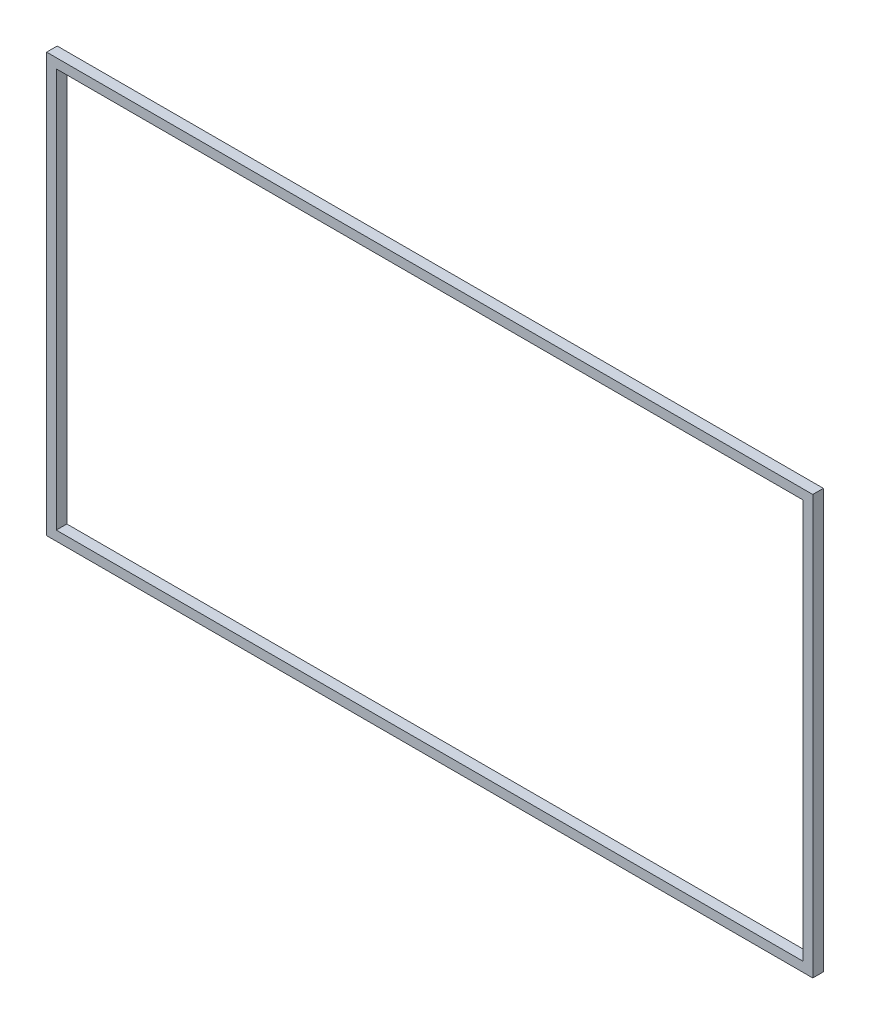
ISO-10303-21;
HEADER;
FILE_DESCRIPTION(('STEP AP214'),'2;1');
FILE_NAME('part.step','',(''),(''),'','','');
FILE_SCHEMA(('AUTOMOTIVE_DESIGN { 1 0 10303 214 1 1 1 1 }'));
ENDSEC;
DATA;
#1=APPLICATION_CONTEXT('core data for automotive mechanical design processes');
#2=APPLICATION_PROTOCOL_DEFINITION('international standard','automotive_design',2000,#1);
#3=PRODUCT_CONTEXT('',#1,'mechanical');
#4=PRODUCT('Part','Part','',(#3));
#5=PRODUCT_RELATED_PRODUCT_CATEGORY('part','',(#4));
#6=PRODUCT_DEFINITION_FORMATION('','',#4);
#7=PRODUCT_DEFINITION_CONTEXT('part definition',#1,'design');
#8=PRODUCT_DEFINITION('design','',#6,#7);
#9=PRODUCT_DEFINITION_SHAPE('','',#8);
#10=(LENGTH_UNIT() NAMED_UNIT(*) SI_UNIT(.MILLI.,.METRE.));
#11=(NAMED_UNIT(*) PLANE_ANGLE_UNIT() SI_UNIT($,.RADIAN.));
#12=(NAMED_UNIT(*) SI_UNIT($,.STERADIAN.) SOLID_ANGLE_UNIT());
#13=UNCERTAINTY_MEASURE_WITH_UNIT(LENGTH_MEASURE(1.E-05),#10,'distance_accuracy_value','');
#14=(GEOMETRIC_REPRESENTATION_CONTEXT(3) GLOBAL_UNCERTAINTY_ASSIGNED_CONTEXT((#13)) GLOBAL_UNIT_ASSIGNED_CONTEXT((#10,
#11,#12)) REPRESENTATION_CONTEXT('',''));
#15=CARTESIAN_POINT('',(0.,0.,0.));
#16=DIRECTION('',(0.,0.,1.));
#17=DIRECTION('',(1.,0.,0.));
#18=AXIS2_PLACEMENT_3D('',#15,#16,#17);
#19=CARTESIAN_POINT('',(-5.684341886081E-13,-1.293757720337E-13,33.));
#20=DIRECTION('',(0.,0.,1.));
#21=DIRECTION('',(1.,0.,0.));
#22=AXIS2_PLACEMENT_3D('',#19,#20,#21);
#23=PLANE('',#22);
#24=DIRECTION('',(0.,-1.,0.));
#25=VECTOR('',#24,1.);
#26=CARTESIAN_POINT('',(-1162.,621.5,33.));
#27=LINE('',#26,#25);
#28=CARTESIAN_POINT('',(-1162.,621.5,33.));
#29=VERTEX_POINT('',#28);
#30=CARTESIAN_POINT('',(-1162.,-621.5,33.));
#31=VERTEX_POINT('',#30);
#32=EDGE_CURVE('E157',#29,#31,#27,.T.);
#33=ORIENTED_EDGE('',*,*,#32,.F.);
#34=DIRECTION('',(-1.,0.,0.));
#35=VECTOR('',#34,1.);
#36=CARTESIAN_POINT('',(1162.,621.5,33.));
#37=LINE('',#36,#35);
#38=CARTESIAN_POINT('',(1162.,621.5,33.));
#39=VERTEX_POINT('',#38);
#40=EDGE_CURVE('E186',#39,#29,#37,.T.);
#41=ORIENTED_EDGE('',*,*,#40,.F.);
#42=DIRECTION('',(0.,1.,0.));
#43=VECTOR('',#42,1.);
#44=CARTESIAN_POINT('',(1162.,-621.5,33.));
#45=LINE('',#44,#43);
#46=CARTESIAN_POINT('',(1162.,-621.5,33.));
#47=VERTEX_POINT('',#46);
#48=EDGE_CURVE('E196',#47,#39,#45,.T.);
#49=ORIENTED_EDGE('',*,*,#48,.F.);
#50=DIRECTION('',(1.,0.,0.));
#51=VECTOR('',#50,1.);
#52=CARTESIAN_POINT('',(-1162.,-621.5,33.));
#53=LINE('',#52,#51);
#54=EDGE_CURVE('E27',#31,#47,#53,.T.);
#55=ORIENTED_EDGE('',*,*,#54,.F.);
#56=EDGE_LOOP('',(#33,#41,#49,#55));
#57=FACE_BOUND('',#56,.T.);
#58=DIRECTION('',(1.,0.,0.));
#59=VECTOR('',#58,1.);
#60=CARTESIAN_POINT('',(-1192.,-651.5,33.));
#61=LINE('',#60,#59);
#62=CARTESIAN_POINT('',(-1192.,-651.5,33.));
#63=VERTEX_POINT('',#62);
#64=CARTESIAN_POINT('',(1192.,-651.5,33.));
#65=VERTEX_POINT('',#64);
#66=EDGE_CURVE('E137',#63,#65,#61,.T.);
#67=ORIENTED_EDGE('',*,*,#66,.T.);
#68=DIRECTION('',(0.,1.,0.));
#69=VECTOR('',#68,1.);
#70=CARTESIAN_POINT('',(1192.,-651.5,33.));
#71=LINE('',#70,#69);
#72=CARTESIAN_POINT('',(1192.,651.5,33.));
#73=VERTEX_POINT('',#72);
#74=EDGE_CURVE('E111',#65,#73,#71,.T.);
#75=ORIENTED_EDGE('',*,*,#74,.T.);
#76=DIRECTION('',(-1.,0.,0.));
#77=VECTOR('',#76,1.);
#78=CARTESIAN_POINT('',(1192.,651.5,33.));
#79=LINE('',#78,#77);
#80=CARTESIAN_POINT('',(-1192.,651.5,33.));
#81=VERTEX_POINT('',#80);
#82=EDGE_CURVE('E130',#73,#81,#79,.T.);
#83=ORIENTED_EDGE('',*,*,#82,.T.);
#84=DIRECTION('',(0.,-1.,0.));
#85=VECTOR('',#84,1.);
#86=CARTESIAN_POINT('',(-1192.,651.5,33.));
#87=LINE('',#86,#85);
#88=EDGE_CURVE('E101',#81,#63,#87,.T.);
#89=ORIENTED_EDGE('',*,*,#88,.T.);
#90=EDGE_LOOP('',(#67,#75,#83,#89));
#91=FACE_BOUND('',#90,.T.);
#92=ADVANCED_FACE('F17',(#57,#91),#23,.T.);
#93=CARTESIAN_POINT('',(-5.684341886081E-13,-1.284275273855E-13,4.547473508865E-13));
#94=DIRECTION('',(0.,0.,1.));
#95=DIRECTION('',(1.,0.,0.));
#96=AXIS2_PLACEMENT_3D('',#93,#94,#95);
#97=PLANE('',#96);
#98=DIRECTION('',(1.,0.,0.));
#99=VECTOR('',#98,1.);
#100=CARTESIAN_POINT('',(-1162.,-621.5,-4.547473508865E-13));
#101=LINE('',#100,#99);
#102=CARTESIAN_POINT('',(-1162.,-621.5,-4.547473508865E-13));
#103=VERTEX_POINT('',#102);
#104=CARTESIAN_POINT('',(1162.,-621.5,0.));
#105=VERTEX_POINT('',#104);
#106=EDGE_CURVE('E11',#103,#105,#101,.T.);
#107=ORIENTED_EDGE('',*,*,#106,.T.);
#108=DIRECTION('',(0.,1.,0.));
#109=VECTOR('',#108,1.);
#110=CARTESIAN_POINT('',(1162.,-621.5,0.));
#111=LINE('',#110,#109);
#112=CARTESIAN_POINT('',(1162.,621.5,0.));
#113=VERTEX_POINT('',#112);
#114=EDGE_CURVE('E80',#105,#113,#111,.T.);
#115=ORIENTED_EDGE('',*,*,#114,.T.);
#116=DIRECTION('',(-1.,0.,0.));
#117=VECTOR('',#116,1.);
#118=CARTESIAN_POINT('',(1162.,621.5,0.));
#119=LINE('',#118,#117);
#120=CARTESIAN_POINT('',(-1162.,621.5,-4.547473508865E-13));
#121=VERTEX_POINT('',#120);
#122=EDGE_CURVE('E189',#113,#121,#119,.T.);
#123=ORIENTED_EDGE('',*,*,#122,.T.);
#124=DIRECTION('',(0.,-1.,0.));
#125=VECTOR('',#124,1.);
#126=CARTESIAN_POINT('',(-1162.,621.5,-4.547473508865E-13));
#127=LINE('',#126,#125);
#128=EDGE_CURVE('E179',#121,#103,#127,.T.);
#129=ORIENTED_EDGE('',*,*,#128,.T.);
#130=EDGE_LOOP('',(#107,#115,#123,#129));
#131=FACE_BOUND('',#130,.T.);
#132=DIRECTION('',(0.,-1.,0.));
#133=VECTOR('',#132,1.);
#134=CARTESIAN_POINT('',(-1192.,651.5,4.547473508865E-13));
#135=LINE('',#134,#133);
#136=CARTESIAN_POINT('',(-1192.,651.5,4.547473508865E-13));
#137=VERTEX_POINT('',#136);
#138=CARTESIAN_POINT('',(-1192.,-651.5,4.547473508865E-13));
#139=VERTEX_POINT('',#138);
#140=EDGE_CURVE('E121',#137,#139,#135,.T.);
#141=ORIENTED_EDGE('',*,*,#140,.F.);
#142=DIRECTION('',(-1.,0.,0.));
#143=VECTOR('',#142,1.);
#144=CARTESIAN_POINT('',(1192.,651.5,0.));
#145=LINE('',#144,#143);
#146=CARTESIAN_POINT('',(1192.,651.5,0.));
#147=VERTEX_POINT('',#146);
#148=EDGE_CURVE('E91',#147,#137,#145,.T.);
#149=ORIENTED_EDGE('',*,*,#148,.F.);
#150=DIRECTION('',(0.,1.,0.));
#151=VECTOR('',#150,1.);
#152=CARTESIAN_POINT('',(1192.,-651.5,0.));
#153=LINE('',#152,#151);
#154=CARTESIAN_POINT('',(1192.,-651.5,0.));
#155=VERTEX_POINT('',#154);
#156=EDGE_CURVE('E139',#155,#147,#153,.T.);
#157=ORIENTED_EDGE('',*,*,#156,.F.);
#158=DIRECTION('',(1.,0.,0.));
#159=VECTOR('',#158,1.);
#160=CARTESIAN_POINT('',(-1192.,-651.5,4.547473508865E-13));
#161=LINE('',#160,#159);
#162=EDGE_CURVE('E136',#139,#155,#161,.T.);
#163=ORIENTED_EDGE('',*,*,#162,.F.);
#164=EDGE_LOOP('',(#141,#149,#157,#163));
#165=FACE_BOUND('',#164,.T.);
#166=ADVANCED_FACE('F19',(#131,#165),#97,.F.);
#167=CARTESIAN_POINT('',(-1162.,-621.5,-4.547473508865E-13));
#168=DIRECTION('',(0.,1.,0.));
#169=DIRECTION('',(1.,0.,0.));
#170=AXIS2_PLACEMENT_3D('',#167,#168,#169);
#171=PLANE('',#170);
#172=DIRECTION('',(0.,0.,1.));
#173=VECTOR('',#172,1.);
#174=CARTESIAN_POINT('',(-1162.,-621.5,-4.547473508865E-13));
#175=LINE('',#174,#173);
#176=EDGE_CURVE('E176',#103,#31,#175,.T.);
#177=ORIENTED_EDGE('',*,*,#176,.T.);
#178=ORIENTED_EDGE('',*,*,#54,.T.);
#179=DIRECTION('',(0.,0.,1.));
#180=VECTOR('',#179,1.);
#181=CARTESIAN_POINT('',(1162.,-621.5,0.));
#182=LINE('',#181,#180);
#183=EDGE_CURVE('E192',#105,#47,#182,.T.);
#184=ORIENTED_EDGE('',*,*,#183,.F.);
#185=ORIENTED_EDGE('',*,*,#106,.F.);
#186=EDGE_LOOP('',(#177,#178,#184,#185));
#187=FACE_BOUND('',#186,.T.);
#188=ADVANCED_FACE('F221',(#187),#171,.T.);
#189=CARTESIAN_POINT('',(1162.,-621.5,0.));
#190=DIRECTION('',(-1.,0.,0.));
#191=DIRECTION('',(0.,0.,1.));
#192=AXIS2_PLACEMENT_3D('',#189,#190,#191);
#193=PLANE('',#192);
#194=ORIENTED_EDGE('',*,*,#183,.T.);
#195=ORIENTED_EDGE('',*,*,#48,.T.);
#196=DIRECTION('',(0.,0.,1.));
#197=VECTOR('',#196,1.);
#198=CARTESIAN_POINT('',(1162.,621.5,0.));
#199=LINE('',#198,#197);
#200=EDGE_CURVE('E182',#113,#39,#199,.T.);
#201=ORIENTED_EDGE('',*,*,#200,.F.);
#202=ORIENTED_EDGE('',*,*,#114,.F.);
#203=EDGE_LOOP('',(#194,#195,#201,#202));
#204=FACE_BOUND('',#203,.T.);
#205=ADVANCED_FACE('F226',(#204),#193,.T.);
#206=CARTESIAN_POINT('',(1162.,621.5,0.));
#207=DIRECTION('',(0.,-1.,0.));
#208=DIRECTION('',(-1.,0.,0.));
#209=AXIS2_PLACEMENT_3D('',#206,#207,#208);
#210=PLANE('',#209);
#211=ORIENTED_EDGE('',*,*,#200,.T.);
#212=ORIENTED_EDGE('',*,*,#40,.T.);
#213=DIRECTION('',(0.,0.,1.));
#214=VECTOR('',#213,1.);
#215=CARTESIAN_POINT('',(-1162.,621.5,-4.547473508865E-13));
#216=LINE('',#215,#214);
#217=EDGE_CURVE('E153',#121,#29,#216,.T.);
#218=ORIENTED_EDGE('',*,*,#217,.F.);
#219=ORIENTED_EDGE('',*,*,#122,.F.);
#220=EDGE_LOOP('',(#211,#212,#218,#219));
#221=FACE_BOUND('',#220,.T.);
#222=ADVANCED_FACE('F236',(#221),#210,.T.);
#223=CARTESIAN_POINT('',(-1162.,621.5,-4.547473508865E-13));
#224=DIRECTION('',(1.,0.,0.));
#225=DIRECTION('',(0.,-1.,0.));
#226=AXIS2_PLACEMENT_3D('',#223,#224,#225);
#227=PLANE('',#226);
#228=ORIENTED_EDGE('',*,*,#217,.T.);
#229=ORIENTED_EDGE('',*,*,#32,.T.);
#230=ORIENTED_EDGE('',*,*,#176,.F.);
#231=ORIENTED_EDGE('',*,*,#128,.F.);
#232=EDGE_LOOP('',(#228,#229,#230,#231));
#233=FACE_BOUND('',#232,.T.);
#234=ADVANCED_FACE('F231',(#233),#227,.T.);
#235=CARTESIAN_POINT('',(-1192.,651.5,4.547473508865E-13));
#236=DIRECTION('',(1.,0.,0.));
#237=DIRECTION('',(0.,-1.,0.));
#238=AXIS2_PLACEMENT_3D('',#235,#236,#237);
#239=PLANE('',#238);
#240=ORIENTED_EDGE('',*,*,#140,.T.);
#241=DIRECTION('',(0.,0.,1.));
#242=VECTOR('',#241,1.);
#243=CARTESIAN_POINT('',(-1192.,-651.5,4.547473508865E-13));
#244=LINE('',#243,#242);
#245=EDGE_CURVE('E124',#139,#63,#244,.T.);
#246=ORIENTED_EDGE('',*,*,#245,.T.);
#247=ORIENTED_EDGE('',*,*,#88,.F.);
#248=DIRECTION('',(0.,0.,1.));
#249=VECTOR('',#248,1.);
#250=CARTESIAN_POINT('',(-1192.,651.5,4.547473508865E-13));
#251=LINE('',#250,#249);
#252=EDGE_CURVE('E127',#137,#81,#251,.T.);
#253=ORIENTED_EDGE('',*,*,#252,.F.);
#254=EDGE_LOOP('',(#240,#246,#247,#253));
#255=FACE_BOUND('',#254,.T.);
#256=ADVANCED_FACE('F123',(#255),#239,.F.);
#257=CARTESIAN_POINT('',(1192.,651.5,0.));
#258=DIRECTION('',(0.,-1.,0.));
#259=DIRECTION('',(-1.,0.,0.));
#260=AXIS2_PLACEMENT_3D('',#257,#258,#259);
#261=PLANE('',#260);
#262=ORIENTED_EDGE('',*,*,#148,.T.);
#263=ORIENTED_EDGE('',*,*,#252,.T.);
#264=ORIENTED_EDGE('',*,*,#82,.F.);
#265=DIRECTION('',(0.,0.,1.));
#266=VECTOR('',#265,1.);
#267=CARTESIAN_POINT('',(1192.,651.5,0.));
#268=LINE('',#267,#266);
#269=EDGE_CURVE('E160',#147,#73,#268,.T.);
#270=ORIENTED_EDGE('',*,*,#269,.F.);
#271=EDGE_LOOP('',(#262,#263,#264,#270));
#272=FACE_BOUND('',#271,.T.);
#273=ADVANCED_FACE('F217',(#272),#261,.F.);
#274=CARTESIAN_POINT('',(1192.,-651.5,0.));
#275=DIRECTION('',(-1.,0.,0.));
#276=DIRECTION('',(0.,0.,1.));
#277=AXIS2_PLACEMENT_3D('',#274,#275,#276);
#278=PLANE('',#277);
#279=ORIENTED_EDGE('',*,*,#156,.T.);
#280=ORIENTED_EDGE('',*,*,#269,.T.);
#281=ORIENTED_EDGE('',*,*,#74,.F.);
#282=DIRECTION('',(0.,0.,1.));
#283=VECTOR('',#282,1.);
#284=CARTESIAN_POINT('',(1192.,-651.5,0.));
#285=LINE('',#284,#283);
#286=EDGE_CURVE('E143',#155,#65,#285,.T.);
#287=ORIENTED_EDGE('',*,*,#286,.F.);
#288=EDGE_LOOP('',(#279,#280,#281,#287));
#289=FACE_BOUND('',#288,.T.);
#290=ADVANCED_FACE('F209',(#289),#278,.F.);
#291=CARTESIAN_POINT('',(-1192.,-651.5,4.547473508865E-13));
#292=DIRECTION('',(0.,1.,0.));
#293=DIRECTION('',(1.,0.,0.));
#294=AXIS2_PLACEMENT_3D('',#291,#292,#293);
#295=PLANE('',#294);
#296=ORIENTED_EDGE('',*,*,#162,.T.);
#297=ORIENTED_EDGE('',*,*,#286,.T.);
#298=ORIENTED_EDGE('',*,*,#66,.F.);
#299=ORIENTED_EDGE('',*,*,#245,.F.);
#300=EDGE_LOOP('',(#296,#297,#298,#299));
#301=FACE_BOUND('',#300,.T.);
#302=ADVANCED_FACE('F134',(#301),#295,.F.);
#303=CLOSED_SHELL('',(#92,#166,#188,#205,#222,#234,#256,#273,#290,#302));
#304=MANIFOLD_SOLID_BREP('B1',#303);
#305=ADVANCED_BREP_SHAPE_REPRESENTATION('',(#18,#304),#14);
#306=SHAPE_DEFINITION_REPRESENTATION(#9,#305);
ENDSEC;
END-ISO-10303-21;
